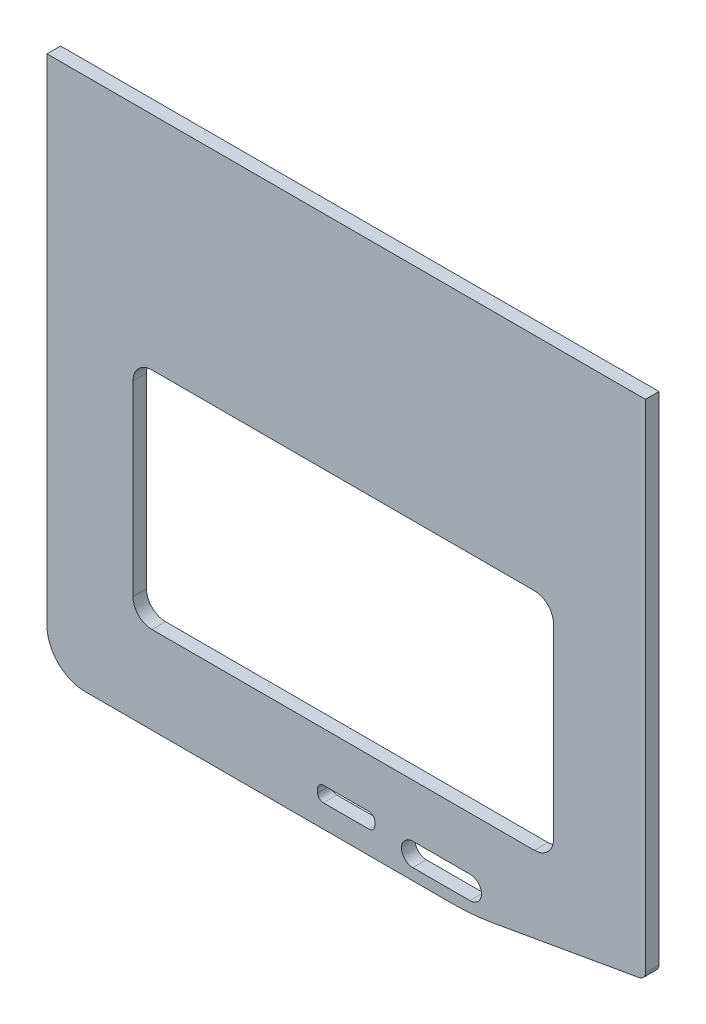
ISO-10303-21;
HEADER;
FILE_DESCRIPTION(('STEP AP214'),'2;1');
FILE_NAME('part.step','',(''),(''),'','','');
FILE_SCHEMA(('AUTOMOTIVE_DESIGN { 1 0 10303 214 1 1 1 1 }'));
ENDSEC;
DATA;
#1=APPLICATION_CONTEXT('core data for automotive mechanical design processes');
#2=APPLICATION_PROTOCOL_DEFINITION('international standard','automotive_design',2000,#1);
#3=PRODUCT_CONTEXT('',#1,'mechanical');
#4=PRODUCT('Part','Part','',(#3));
#5=PRODUCT_RELATED_PRODUCT_CATEGORY('part','',(#4));
#6=PRODUCT_DEFINITION_FORMATION('','',#4);
#7=PRODUCT_DEFINITION_CONTEXT('part definition',#1,'design');
#8=PRODUCT_DEFINITION('design','',#6,#7);
#9=PRODUCT_DEFINITION_SHAPE('','',#8);
#10=(LENGTH_UNIT() NAMED_UNIT(*) SI_UNIT(.MILLI.,.METRE.));
#11=(NAMED_UNIT(*) PLANE_ANGLE_UNIT() SI_UNIT($,.RADIAN.));
#12=(NAMED_UNIT(*) SI_UNIT($,.STERADIAN.) SOLID_ANGLE_UNIT());
#13=UNCERTAINTY_MEASURE_WITH_UNIT(LENGTH_MEASURE(1.E-05),#10,'distance_accuracy_value','');
#14=(GEOMETRIC_REPRESENTATION_CONTEXT(3) GLOBAL_UNCERTAINTY_ASSIGNED_CONTEXT((#13)) GLOBAL_UNIT_ASSIGNED_CONTEXT((#10,
#11,#12)) REPRESENTATION_CONTEXT('',''));
#15=CARTESIAN_POINT('',(0.,0.,0.));
#16=DIRECTION('',(0.,0.,1.));
#17=DIRECTION('',(1.,0.,0.));
#18=AXIS2_PLACEMENT_3D('',#15,#16,#17);
#19=CARTESIAN_POINT('',(157.112,260.,-7.112));
#20=DIRECTION('',(-1.,0.,0.));
#21=DIRECTION('',(0.,0.,1.));
#22=AXIS2_PLACEMENT_3D('',#19,#20,#21);
#23=PLANE('',#22);
#24=DIRECTION('',(0.,-1.,0.));
#25=VECTOR('',#24,1.);
#26=CARTESIAN_POINT('',(157.112,260.,0.));
#27=LINE('',#26,#25);
#28=CARTESIAN_POINT('',(157.112,260.,0.));
#29=VERTEX_POINT('',#28);
#30=CARTESIAN_POINT('',(157.112,-0.643601475291244,0.));
#31=VERTEX_POINT('',#30);
#32=EDGE_CURVE('E358',#29,#31,#27,.T.);
#33=ORIENTED_EDGE('',*,*,#32,.T.);
#34=DIRECTION('',(0.,0.,1.));
#35=VECTOR('',#34,1.);
#36=CARTESIAN_POINT('',(157.112,-0.643601475291244,-7.112));
#37=LINE('',#36,#35);
#38=CARTESIAN_POINT('',(157.112,-0.643601475291244,-7.112));
#39=VERTEX_POINT('',#38);
#40=EDGE_CURVE('E46',#31,#39,#37,.F.);
#41=ORIENTED_EDGE('',*,*,#40,.T.);
#42=DIRECTION('',(0.,-1.,0.));
#43=VECTOR('',#42,1.);
#44=CARTESIAN_POINT('',(157.112,260.,-7.112));
#45=LINE('',#44,#43);
#46=CARTESIAN_POINT('',(157.112,260.,-7.112));
#47=VERTEX_POINT('',#46);
#48=EDGE_CURVE('E374',#47,#39,#45,.T.);
#49=ORIENTED_EDGE('',*,*,#48,.F.);
#50=DIRECTION('',(0.,0.,1.));
#51=VECTOR('',#50,1.);
#52=CARTESIAN_POINT('',(157.112,260.,-7.112));
#53=LINE('',#52,#51);
#54=EDGE_CURVE('E385',#47,#29,#53,.T.);
#55=ORIENTED_EDGE('',*,*,#54,.T.);
#56=EDGE_LOOP('',(#33,#41,#49,#55));
#57=FACE_BOUND('',#56,.T.);
#58=ADVANCED_FACE('F38',(#57),#23,.F.);
#59=CARTESIAN_POINT('',(157.112,-20.0000000000004,-7.112));
#60=DIRECTION('',(0.,1.,0.));
#61=DIRECTION('',(-1.,0.,0.));
#62=AXIS2_PLACEMENT_3D('',#59,#60,#61);
#63=PLANE('',#62);
#64=DIRECTION('',(-1.,0.,0.));
#65=VECTOR('',#64,1.);
#66=CARTESIAN_POINT('',(157.112,-20.0000000000004,0.));
#67=LINE('',#66,#65);
#68=CARTESIAN_POINT('',(55.8728512630026,-20.0000000000004,0.));
#69=VERTEX_POINT('',#68);
#70=CARTESIAN_POINT('',(-137.112,-20.0000000000003,0.));
#71=VERTEX_POINT('',#70);
#72=EDGE_CURVE('E388',#69,#71,#67,.T.);
#73=ORIENTED_EDGE('',*,*,#72,.T.);
#74=DIRECTION('',(0.,0.,1.));
#75=VECTOR('',#74,1.);
#76=CARTESIAN_POINT('',(-137.112,-20.0000000000003,-7.112));
#77=LINE('',#76,#75);
#78=CARTESIAN_POINT('',(-137.112,-20.0000000000003,-7.112));
#79=VERTEX_POINT('',#78);
#80=EDGE_CURVE('E439',#71,#79,#77,.F.);
#81=ORIENTED_EDGE('',*,*,#80,.T.);
#82=DIRECTION('',(-1.,0.,0.));
#83=VECTOR('',#82,1.);
#84=CARTESIAN_POINT('',(157.112,-20.0000000000004,-7.112));
#85=LINE('',#84,#83);
#86=CARTESIAN_POINT('',(55.8728512630026,-20.0000000000004,-7.112));
#87=VERTEX_POINT('',#86);
#88=EDGE_CURVE('E377',#87,#79,#85,.T.);
#89=ORIENTED_EDGE('',*,*,#88,.F.);
#90=DIRECTION('',(0.,0.,1.));
#91=VECTOR('',#90,1.);
#92=CARTESIAN_POINT('',(55.8728512630026,-20.0000000000004,-7.112));
#93=LINE('',#92,#91);
#94=EDGE_CURVE('E423',#87,#69,#93,.T.);
#95=ORIENTED_EDGE('',*,*,#94,.T.);
#96=EDGE_LOOP('',(#73,#81,#89,#95));
#97=FACE_BOUND('',#96,.T.);
#98=ADVANCED_FACE('F472',(#97),#63,.F.);
#99=CARTESIAN_POINT('',(-157.112,260.,-7.112));
#100=DIRECTION('',(1.,0.,0.));
#101=DIRECTION('',(0.,0.,-1.));
#102=AXIS2_PLACEMENT_3D('',#99,#100,#101);
#103=PLANE('',#102);
#104=DIRECTION('',(0.,1.,0.));
#105=VECTOR('',#104,1.);
#106=CARTESIAN_POINT('',(-157.112,260.,-7.112));
#107=LINE('',#106,#105);
#108=CARTESIAN_POINT('',(-157.112,-3.33066907387547E-13,-7.112));
#109=VERTEX_POINT('',#108);
#110=CARTESIAN_POINT('',(-157.112,260.,-7.112));
#111=VERTEX_POINT('',#110);
#112=EDGE_CURVE('E381',#109,#111,#107,.T.);
#113=ORIENTED_EDGE('',*,*,#112,.F.);
#114=DIRECTION('',(0.,0.,1.));
#115=VECTOR('',#114,1.);
#116=CARTESIAN_POINT('',(-157.112,-3.33066907387547E-13,-7.112));
#117=LINE('',#116,#115);
#118=CARTESIAN_POINT('',(-157.112,-3.33066907387547E-13,0.));
#119=VERTEX_POINT('',#118);
#120=EDGE_CURVE('E434',#109,#119,#117,.T.);
#121=ORIENTED_EDGE('',*,*,#120,.T.);
#122=DIRECTION('',(0.,1.,0.));
#123=VECTOR('',#122,1.);
#124=CARTESIAN_POINT('',(-157.112,260.,0.));
#125=LINE('',#124,#123);
#126=CARTESIAN_POINT('',(-157.112,260.,0.));
#127=VERTEX_POINT('',#126);
#128=EDGE_CURVE('E391',#119,#127,#125,.T.);
#129=ORIENTED_EDGE('',*,*,#128,.T.);
#130=DIRECTION('',(0.,0.,1.));
#131=VECTOR('',#130,1.);
#132=CARTESIAN_POINT('',(-157.112,260.,-7.112));
#133=LINE('',#132,#131);
#134=EDGE_CURVE('E396',#111,#127,#133,.T.);
#135=ORIENTED_EDGE('',*,*,#134,.F.);
#136=EDGE_LOOP('',(#113,#121,#129,#135));
#137=FACE_BOUND('',#136,.T.);
#138=ADVANCED_FACE('F480',(#137),#103,.F.);
#139=CARTESIAN_POINT('',(157.112,260.,-7.112));
#140=DIRECTION('',(0.,-1.,0.));
#141=DIRECTION('',(0.,0.,-1.));
#142=AXIS2_PLACEMENT_3D('',#139,#140,#141);
#143=PLANE('',#142);
#144=DIRECTION('',(1.,0.,0.));
#145=VECTOR('',#144,1.);
#146=CARTESIAN_POINT('',(157.112,260.,0.));
#147=LINE('',#146,#145);
#148=EDGE_CURVE('E378',#127,#29,#147,.T.);
#149=ORIENTED_EDGE('',*,*,#148,.T.);
#150=ORIENTED_EDGE('',*,*,#54,.F.);
#151=DIRECTION('',(1.,0.,0.));
#152=VECTOR('',#151,1.);
#153=CARTESIAN_POINT('',(157.112,260.,-7.112));
#154=LINE('',#153,#152);
#155=EDGE_CURVE('E383',#111,#47,#154,.T.);
#156=ORIENTED_EDGE('',*,*,#155,.F.);
#157=ORIENTED_EDGE('',*,*,#134,.T.);
#158=EDGE_LOOP('',(#149,#150,#156,#157));
#159=FACE_BOUND('',#158,.T.);
#160=ADVANCED_FACE('F484',(#159),#143,.F.);
#161=CARTESIAN_POINT('',(0.,0.,-7.112));
#162=DIRECTION('',(0.,0.,-1.));
#163=DIRECTION('',(-1.,0.,0.));
#164=AXIS2_PLACEMENT_3D('',#161,#162,#163);
#165=PLANE('',#164);
#166=CARTESIAN_POINT('',(35.,-7.99999999999999,-7.112));
#167=DIRECTION('',(0.,0.,1.));
#168=DIRECTION('',(1.,0.,0.));
#169=AXIS2_PLACEMENT_3D('',#166,#167,#168);
#170=CIRCLE('',#169,6.);
#171=CARTESIAN_POINT('',(35.,-1.99999999999999,-7.112));
#172=VERTEX_POINT('',#171);
#173=CARTESIAN_POINT('',(35.,-14.,-7.112));
#174=VERTEX_POINT('',#173);
#175=EDGE_CURVE('E224',#172,#174,#170,.T.);
#176=ORIENTED_EDGE('',*,*,#175,.T.);
#177=DIRECTION('',(1.,0.,0.));
#178=VECTOR('',#177,1.);
#179=CARTESIAN_POINT('',(35.,-14.,-7.112));
#180=LINE('',#179,#178);
#181=CARTESIAN_POINT('',(65.,-14.,-7.112));
#182=VERTEX_POINT('',#181);
#183=EDGE_CURVE('E233',#174,#182,#180,.T.);
#184=ORIENTED_EDGE('',*,*,#183,.T.);
#185=CARTESIAN_POINT('',(65.,-7.99999999999999,-7.112));
#186=DIRECTION('',(0.,0.,1.));
#187=DIRECTION('',(1.,0.,0.));
#188=AXIS2_PLACEMENT_3D('',#185,#186,#187);
#189=CIRCLE('',#188,6.);
#190=CARTESIAN_POINT('',(65.,-1.99999999999999,-7.112));
#191=VERTEX_POINT('',#190);
#192=EDGE_CURVE('E53',#182,#191,#189,.T.);
#193=ORIENTED_EDGE('',*,*,#192,.T.);
#194=DIRECTION('',(-1.,0.,0.));
#195=VECTOR('',#194,1.);
#196=CARTESIAN_POINT('',(35.,-1.99999999999999,-7.112));
#197=LINE('',#196,#195);
#198=EDGE_CURVE('E230',#191,#172,#197,.T.);
#199=ORIENTED_EDGE('',*,*,#198,.T.);
#200=EDGE_LOOP('',(#176,#184,#193,#199));
#201=FACE_BOUND('',#200,.T.);
#202=ORIENTED_EDGE('',*,*,#48,.T.);
#203=CARTESIAN_POINT('',(153.112,-0.64360147529126,-7.112));
#204=DIRECTION('',(0.,0.,-1.));
#205=DIRECTION('',(-1.,0.,0.));
#206=AXIS2_PLACEMENT_3D('',#203,#204,#205);
#207=CIRCLE('',#206,4.);
#208=CARTESIAN_POINT('',(153.806592710668,-4.5828324873401,-7.112));
#209=VERTEX_POINT('',#208);
#210=EDGE_CURVE('E11',#39,#209,#207,.T.);
#211=ORIENTED_EDGE('',*,*,#210,.T.);
#212=DIRECTION('',(-0.984807753012209,-0.173648177666924,0.));
#213=VECTOR('',#212,1.);
#214=CARTESIAN_POINT('',(66.3714908861131,-20.0000000000004,-7.112));
#215=LINE('',#214,#213);
#216=CARTESIAN_POINT('',(76.7106325830335,-18.1769303614655,-7.112));
#217=VERTEX_POINT('',#216);
#218=EDGE_CURVE('E259',#209,#217,#215,.T.);
#219=ORIENTED_EDGE('',*,*,#218,.T.);
#220=CARTESIAN_POINT('',(55.8728512630027,99.9999999999996,-7.112));
#221=DIRECTION('',(0.,0.,-1.));
#222=DIRECTION('',(-1.,0.,0.));
#223=AXIS2_PLACEMENT_3D('',#220,#221,#222);
#224=CIRCLE('',#223,120.);
#225=EDGE_CURVE('E432',#217,#87,#224,.T.);
#226=ORIENTED_EDGE('',*,*,#225,.T.);
#227=ORIENTED_EDGE('',*,*,#88,.T.);
#228=CARTESIAN_POINT('',(-137.112,-3.33066907387547E-13,-7.112));
#229=DIRECTION('',(0.,0.,-1.));
#230=DIRECTION('',(-1.,0.,0.));
#231=AXIS2_PLACEMENT_3D('',#228,#229,#230);
#232=CIRCLE('',#231,20.);
#233=EDGE_CURVE('E441',#79,#109,#232,.T.);
#234=ORIENTED_EDGE('',*,*,#233,.T.);
#235=ORIENTED_EDGE('',*,*,#112,.T.);
#236=ORIENTED_EDGE('',*,*,#155,.T.);
#237=EDGE_LOOP('',(#202,#211,#219,#226,#227,#234,#235,#236));
#238=FACE_BOUND('',#237,.T.);
#239=CARTESIAN_POINT('',(-12.,-5.,-7.112));
#240=DIRECTION('',(0.,0.,1.));
#241=DIRECTION('',(-1.,0.,0.));
#242=AXIS2_PLACEMENT_3D('',#239,#240,#241);
#243=CIRCLE('',#242,3.);
#244=CARTESIAN_POINT('',(-15.,-5.,-7.112));
#245=VERTEX_POINT('',#244);
#246=CARTESIAN_POINT('',(-12.,-8.,-7.112));
#247=VERTEX_POINT('',#246);
#248=EDGE_CURVE('E263',#245,#247,#243,.T.);
#249=ORIENTED_EDGE('',*,*,#248,.T.);
#250=DIRECTION('',(1.,0.,0.));
#251=VECTOR('',#250,1.);
#252=CARTESIAN_POINT('',(-12.,-8.,-7.112));
#253=LINE('',#252,#251);
#254=CARTESIAN_POINT('',(12.,-8.,-7.112));
#255=VERTEX_POINT('',#254);
#256=EDGE_CURVE('E266',#247,#255,#253,.T.);
#257=ORIENTED_EDGE('',*,*,#256,.T.);
#258=CARTESIAN_POINT('',(12.,-5.,-7.112));
#259=DIRECTION('',(0.,0.,1.));
#260=DIRECTION('',(1.,0.,0.));
#261=AXIS2_PLACEMENT_3D('',#258,#259,#260);
#262=CIRCLE('',#261,3.);
#263=CARTESIAN_POINT('',(15.,-5.,-7.112));
#264=VERTEX_POINT('',#263);
#265=EDGE_CURVE('E270',#255,#264,#262,.T.);
#266=ORIENTED_EDGE('',*,*,#265,.T.);
#267=DIRECTION('',(0.,1.,0.));
#268=VECTOR('',#267,1.);
#269=CARTESIAN_POINT('',(15.,-5.,-7.112));
#270=LINE('',#269,#268);
#271=CARTESIAN_POINT('',(15.,-3.,-7.112));
#272=VERTEX_POINT('',#271);
#273=EDGE_CURVE('E273',#264,#272,#270,.T.);
#274=ORIENTED_EDGE('',*,*,#273,.T.);
#275=CARTESIAN_POINT('',(12.,-3.,-7.112));
#276=DIRECTION('',(0.,0.,1.));
#277=DIRECTION('',(1.,0.,0.));
#278=AXIS2_PLACEMENT_3D('',#275,#276,#277);
#279=CIRCLE('',#278,3.);
#280=CARTESIAN_POINT('',(12.,0.,-7.112));
#281=VERTEX_POINT('',#280);
#282=EDGE_CURVE('E276',#272,#281,#279,.T.);
#283=ORIENTED_EDGE('',*,*,#282,.T.);
#284=DIRECTION('',(-1.,0.,0.));
#285=VECTOR('',#284,1.);
#286=CARTESIAN_POINT('',(-12.,0.,-7.112));
#287=LINE('',#286,#285);
#288=CARTESIAN_POINT('',(-12.,0.,-7.112));
#289=VERTEX_POINT('',#288);
#290=EDGE_CURVE('E279',#281,#289,#287,.T.);
#291=ORIENTED_EDGE('',*,*,#290,.T.);
#292=CARTESIAN_POINT('',(-12.,-3.,-7.112));
#293=DIRECTION('',(0.,0.,1.));
#294=DIRECTION('',(-1.,0.,0.));
#295=AXIS2_PLACEMENT_3D('',#292,#293,#294);
#296=CIRCLE('',#295,3.);
#297=CARTESIAN_POINT('',(-15.,-3.,-7.112));
#298=VERTEX_POINT('',#297);
#299=EDGE_CURVE('E282',#289,#298,#296,.T.);
#300=ORIENTED_EDGE('',*,*,#299,.T.);
#301=DIRECTION('',(0.,-1.,0.));
#302=VECTOR('',#301,1.);
#303=CARTESIAN_POINT('',(-15.,-5.,-7.112));
#304=LINE('',#303,#302);
#305=EDGE_CURVE('E285',#298,#245,#304,.T.);
#306=ORIENTED_EDGE('',*,*,#305,.T.);
#307=EDGE_LOOP('',(#249,#257,#266,#274,#283,#291,#300,#306));
#308=FACE_BOUND('',#307,.T.);
#309=CARTESIAN_POINT('',(-101.985505074367,35.7979688309342,-7.112));
#310=DIRECTION('',(0.,0.,1.));
#311=DIRECTION('',(1.,0.,0.));
#312=AXIS2_PLACEMENT_3D('',#309,#310,#311);
#313=CIRCLE('',#312,9.99999999999999);
#314=CARTESIAN_POINT('',(-111.985505074367,35.7979688309342,-7.112));
#315=VERTEX_POINT('',#314);
#316=CARTESIAN_POINT('',(-101.985505074367,25.7979688309342,-7.112));
#317=VERTEX_POINT('',#316);
#318=EDGE_CURVE('E312',#315,#317,#313,.T.);
#319=ORIENTED_EDGE('',*,*,#318,.T.);
#320=DIRECTION('',(1.,0.,0.));
#321=VECTOR('',#320,1.);
#322=CARTESIAN_POINT('',(-101.985505074367,25.7979688309342,-7.112));
#323=LINE('',#322,#321);
#324=CARTESIAN_POINT('',(98.8038517576797,25.7979688309342,-7.112));
#325=VERTEX_POINT('',#324);
#326=EDGE_CURVE('E329',#317,#325,#323,.T.);
#327=ORIENTED_EDGE('',*,*,#326,.T.);
#328=CARTESIAN_POINT('',(98.8038517576797,35.7979688309342,-7.112));
#329=DIRECTION('',(0.,0.,1.));
#330=DIRECTION('',(1.,0.,0.));
#331=AXIS2_PLACEMENT_3D('',#328,#329,#330);
#332=CIRCLE('',#331,10.);
#333=CARTESIAN_POINT('',(108.80385175768,35.7979688309342,-7.112));
#334=VERTEX_POINT('',#333);
#335=EDGE_CURVE('E332',#325,#334,#332,.T.);
#336=ORIENTED_EDGE('',*,*,#335,.T.);
#337=DIRECTION('',(0.,1.,0.));
#338=VECTOR('',#337,1.);
#339=CARTESIAN_POINT('',(108.80385175768,133.817457954109,-7.112));
#340=LINE('',#339,#338);
#341=CARTESIAN_POINT('',(108.80385175768,133.817457954109,-7.112));
#342=VERTEX_POINT('',#341);
#343=EDGE_CURVE('E335',#334,#342,#340,.T.);
#344=ORIENTED_EDGE('',*,*,#343,.T.);
#345=CARTESIAN_POINT('',(98.8038517576797,133.817457954109,-7.112));
#346=DIRECTION('',(0.,0.,1.));
#347=DIRECTION('',(-1.,0.,0.));
#348=AXIS2_PLACEMENT_3D('',#345,#346,#347);
#349=CIRCLE('',#348,10.);
#350=CARTESIAN_POINT('',(98.8038517576797,143.817457954109,-7.112));
#351=VERTEX_POINT('',#350);
#352=EDGE_CURVE('E338',#342,#351,#349,.T.);
#353=ORIENTED_EDGE('',*,*,#352,.T.);
#354=DIRECTION('',(-1.,0.,0.));
#355=VECTOR('',#354,1.);
#356=CARTESIAN_POINT('',(-101.985505074367,143.817457954109,-7.112));
#357=LINE('',#356,#355);
#358=CARTESIAN_POINT('',(-101.985505074367,143.817457954109,-7.112));
#359=VERTEX_POINT('',#358);
#360=EDGE_CURVE('E341',#351,#359,#357,.T.);
#361=ORIENTED_EDGE('',*,*,#360,.T.);
#362=CARTESIAN_POINT('',(-101.985505074367,133.817457954109,-7.112));
#363=DIRECTION('',(0.,0.,1.));
#364=DIRECTION('',(1.,0.,0.));
#365=AXIS2_PLACEMENT_3D('',#362,#363,#364);
#366=CIRCLE('',#365,10.);
#367=CARTESIAN_POINT('',(-111.985505074367,133.817457954109,-7.112));
#368=VERTEX_POINT('',#367);
#369=EDGE_CURVE('E344',#359,#368,#366,.T.);
#370=ORIENTED_EDGE('',*,*,#369,.T.);
#371=DIRECTION('',(0.,-1.,0.));
#372=VECTOR('',#371,1.);
#373=CARTESIAN_POINT('',(-111.985505074367,133.817457954109,-7.112));
#374=LINE('',#373,#372);
#375=EDGE_CURVE('E347',#368,#315,#374,.T.);
#376=ORIENTED_EDGE('',*,*,#375,.T.);
#377=EDGE_LOOP('',(#319,#327,#336,#344,#353,#361,#370,#376));
#378=FACE_BOUND('',#377,.T.);
#379=ADVANCED_FACE('F237',(#201,#238,#308,#378),#165,.T.);
#380=CARTESIAN_POINT('',(0.,0.,0.));
#381=DIRECTION('',(0.,0.,-1.));
#382=DIRECTION('',(-1.,0.,0.));
#383=AXIS2_PLACEMENT_3D('',#380,#381,#382);
#384=PLANE('',#383);
#385=DIRECTION('',(1.,0.,0.));
#386=VECTOR('',#385,1.);
#387=CARTESIAN_POINT('',(35.,-14.,0.));
#388=LINE('',#387,#386);
#389=CARTESIAN_POINT('',(35.,-14.,0.));
#390=VERTEX_POINT('',#389);
#391=CARTESIAN_POINT('',(65.,-14.,0.));
#392=VERTEX_POINT('',#391);
#393=EDGE_CURVE('E249',#390,#392,#388,.T.);
#394=ORIENTED_EDGE('',*,*,#393,.F.);
#395=CARTESIAN_POINT('',(35.,-7.99999999999999,0.));
#396=DIRECTION('',(0.,0.,1.));
#397=DIRECTION('',(1.,0.,0.));
#398=AXIS2_PLACEMENT_3D('',#395,#396,#397);
#399=CIRCLE('',#398,6.);
#400=CARTESIAN_POINT('',(35.,-1.99999999999999,0.));
#401=VERTEX_POINT('',#400);
#402=EDGE_CURVE('E61',#401,#390,#399,.T.);
#403=ORIENTED_EDGE('',*,*,#402,.F.);
#404=DIRECTION('',(-1.,0.,0.));
#405=VECTOR('',#404,1.);
#406=CARTESIAN_POINT('',(35.,-1.99999999999999,0.));
#407=LINE('',#406,#405);
#408=CARTESIAN_POINT('',(65.,-1.99999999999999,0.));
#409=VERTEX_POINT('',#408);
#410=EDGE_CURVE('E240',#409,#401,#407,.T.);
#411=ORIENTED_EDGE('',*,*,#410,.F.);
#412=CARTESIAN_POINT('',(65.,-7.99999999999999,0.));
#413=DIRECTION('',(0.,0.,1.));
#414=DIRECTION('',(1.,0.,0.));
#415=AXIS2_PLACEMENT_3D('',#412,#413,#414);
#416=CIRCLE('',#415,6.);
#417=EDGE_CURVE('E243',#392,#409,#416,.T.);
#418=ORIENTED_EDGE('',*,*,#417,.F.);
#419=EDGE_LOOP('',(#394,#403,#411,#418));
#420=FACE_BOUND('',#419,.T.);
#421=DIRECTION('',(1.,0.,0.));
#422=VECTOR('',#421,1.);
#423=CARTESIAN_POINT('',(-12.,-8.,0.));
#424=LINE('',#423,#422);
#425=CARTESIAN_POINT('',(-12.,-8.,0.));
#426=VERTEX_POINT('',#425);
#427=CARTESIAN_POINT('',(12.,-8.,0.));
#428=VERTEX_POINT('',#427);
#429=EDGE_CURVE('E290',#426,#428,#424,.T.);
#430=ORIENTED_EDGE('',*,*,#429,.F.);
#431=CARTESIAN_POINT('',(-12.,-5.,0.));
#432=DIRECTION('',(0.,0.,1.));
#433=DIRECTION('',(-1.,0.,0.));
#434=AXIS2_PLACEMENT_3D('',#431,#432,#433);
#435=CIRCLE('',#434,3.);
#436=CARTESIAN_POINT('',(-15.,-5.,0.));
#437=VERTEX_POINT('',#436);
#438=EDGE_CURVE('E261',#437,#426,#435,.T.);
#439=ORIENTED_EDGE('',*,*,#438,.F.);
#440=DIRECTION('',(0.,-1.,0.));
#441=VECTOR('',#440,1.);
#442=CARTESIAN_POINT('',(-15.,-5.,0.));
#443=LINE('',#442,#441);
#444=CARTESIAN_POINT('',(-15.,-3.,0.));
#445=VERTEX_POINT('',#444);
#446=EDGE_CURVE('E267',#445,#437,#443,.T.);
#447=ORIENTED_EDGE('',*,*,#446,.F.);
#448=CARTESIAN_POINT('',(-12.,-3.,0.));
#449=DIRECTION('',(0.,0.,1.));
#450=DIRECTION('',(-1.,0.,0.));
#451=AXIS2_PLACEMENT_3D('',#448,#449,#450);
#452=CIRCLE('',#451,3.);
#453=CARTESIAN_POINT('',(-12.,0.,0.));
#454=VERTEX_POINT('',#453);
#455=EDGE_CURVE('E305',#454,#445,#452,.T.);
#456=ORIENTED_EDGE('',*,*,#455,.F.);
#457=DIRECTION('',(-1.,0.,0.));
#458=VECTOR('',#457,1.);
#459=CARTESIAN_POINT('',(-12.,0.,0.));
#460=LINE('',#459,#458);
#461=CARTESIAN_POINT('',(12.,0.,0.));
#462=VERTEX_POINT('',#461);
#463=EDGE_CURVE('E302',#462,#454,#460,.T.);
#464=ORIENTED_EDGE('',*,*,#463,.F.);
#465=CARTESIAN_POINT('',(12.,-3.,0.));
#466=DIRECTION('',(0.,0.,1.));
#467=DIRECTION('',(1.,0.,0.));
#468=AXIS2_PLACEMENT_3D('',#465,#466,#467);
#469=CIRCLE('',#468,3.);
#470=CARTESIAN_POINT('',(15.,-3.,0.));
#471=VERTEX_POINT('',#470);
#472=EDGE_CURVE('E299',#471,#462,#469,.T.);
#473=ORIENTED_EDGE('',*,*,#472,.F.);
#474=DIRECTION('',(0.,1.,0.));
#475=VECTOR('',#474,1.);
#476=CARTESIAN_POINT('',(15.,-5.,0.));
#477=LINE('',#476,#475);
#478=CARTESIAN_POINT('',(15.,-5.,0.));
#479=VERTEX_POINT('',#478);
#480=EDGE_CURVE('E296',#479,#471,#477,.T.);
#481=ORIENTED_EDGE('',*,*,#480,.F.);
#482=CARTESIAN_POINT('',(12.,-5.,0.));
#483=DIRECTION('',(0.,0.,1.));
#484=DIRECTION('',(1.,0.,0.));
#485=AXIS2_PLACEMENT_3D('',#482,#483,#484);
#486=CIRCLE('',#485,3.);
#487=EDGE_CURVE('E293',#428,#479,#486,.T.);
#488=ORIENTED_EDGE('',*,*,#487,.F.);
#489=EDGE_LOOP('',(#430,#439,#447,#456,#464,#473,#481,#488));
#490=FACE_BOUND('',#489,.T.);
#491=DIRECTION('',(-1.,0.,0.));
#492=VECTOR('',#491,1.);
#493=CARTESIAN_POINT('',(0.,25.7979688309342,0.));
#494=LINE('',#493,#492);
#495=CARTESIAN_POINT('',(98.8038517576797,25.7979688309342,0.));
#496=VERTEX_POINT('',#495);
#497=CARTESIAN_POINT('',(-101.985505074367,25.7979688309342,0.));
#498=VERTEX_POINT('',#497);
#499=EDGE_CURVE('E399',#496,#498,#494,.T.);
#500=ORIENTED_EDGE('',*,*,#499,.T.);
#501=CARTESIAN_POINT('',(-101.985505074367,35.7979688309342,0.));
#502=DIRECTION('',(0.,0.,1.));
#503=DIRECTION('',(1.,0.,0.));
#504=AXIS2_PLACEMENT_3D('',#501,#502,#503);
#505=CIRCLE('',#504,9.99999999999999);
#506=CARTESIAN_POINT('',(-111.985505074367,35.7979688309342,0.));
#507=VERTEX_POINT('',#506);
#508=EDGE_CURVE('E420',#498,#507,#505,.F.);
#509=ORIENTED_EDGE('',*,*,#508,.T.);
#510=DIRECTION('',(0.,1.,0.));
#511=VECTOR('',#510,1.);
#512=CARTESIAN_POINT('',(-111.985505074367,0.,0.));
#513=LINE('',#512,#511);
#514=CARTESIAN_POINT('',(-111.985505074367,133.817457954109,0.));
#515=VERTEX_POINT('',#514);
#516=EDGE_CURVE('E417',#507,#515,#513,.T.);
#517=ORIENTED_EDGE('',*,*,#516,.T.);
#518=CARTESIAN_POINT('',(-101.985505074367,133.817457954109,0.));
#519=DIRECTION('',(0.,0.,1.));
#520=DIRECTION('',(1.,0.,0.));
#521=AXIS2_PLACEMENT_3D('',#518,#519,#520);
#522=CIRCLE('',#521,10.);
#523=CARTESIAN_POINT('',(-101.985505074367,143.817457954109,0.));
#524=VERTEX_POINT('',#523);
#525=EDGE_CURVE('E414',#515,#524,#522,.F.);
#526=ORIENTED_EDGE('',*,*,#525,.T.);
#527=DIRECTION('',(-1.,0.,0.));
#528=VECTOR('',#527,1.);
#529=CARTESIAN_POINT('',(0.,143.817457954109,0.));
#530=LINE('',#529,#528);
#531=CARTESIAN_POINT('',(98.8038517576797,143.817457954109,0.));
#532=VERTEX_POINT('',#531);
#533=EDGE_CURVE('E411',#524,#532,#530,.F.);
#534=ORIENTED_EDGE('',*,*,#533,.T.);
#535=CARTESIAN_POINT('',(98.8038517576797,133.817457954109,0.));
#536=DIRECTION('',(0.,0.,1.));
#537=DIRECTION('',(1.,0.,0.));
#538=AXIS2_PLACEMENT_3D('',#535,#536,#537);
#539=CIRCLE('',#538,10.);
#540=CARTESIAN_POINT('',(108.80385175768,133.817457954109,0.));
#541=VERTEX_POINT('',#540);
#542=EDGE_CURVE('E408',#532,#541,#539,.F.);
#543=ORIENTED_EDGE('',*,*,#542,.T.);
#544=DIRECTION('',(0.,1.,0.));
#545=VECTOR('',#544,1.);
#546=CARTESIAN_POINT('',(108.80385175768,0.,0.));
#547=LINE('',#546,#545);
#548=CARTESIAN_POINT('',(108.80385175768,35.7979688309342,0.));
#549=VERTEX_POINT('',#548);
#550=EDGE_CURVE('E405',#541,#549,#547,.F.);
#551=ORIENTED_EDGE('',*,*,#550,.T.);
#552=CARTESIAN_POINT('',(98.8038517576797,35.7979688309342,0.));
#553=DIRECTION('',(0.,0.,1.));
#554=DIRECTION('',(1.,0.,0.));
#555=AXIS2_PLACEMENT_3D('',#552,#553,#554);
#556=CIRCLE('',#555,10.);
#557=EDGE_CURVE('E402',#549,#496,#556,.F.);
#558=ORIENTED_EDGE('',*,*,#557,.T.);
#559=EDGE_LOOP('',(#500,#509,#517,#526,#534,#543,#551,#558));
#560=FACE_BOUND('',#559,.T.);
#561=DIRECTION('',(-0.984807753012209,-0.173648177666924,0.));
#562=VECTOR('',#561,1.);
#563=CARTESIAN_POINT('',(66.3714908861131,-20.0000000000004,0.));
#564=LINE('',#563,#562);
#565=CARTESIAN_POINT('',(153.806592710668,-4.5828324873401,0.));
#566=VERTEX_POINT('',#565);
#567=CARTESIAN_POINT('',(76.7106325830335,-18.1769303614655,0.));
#568=VERTEX_POINT('',#567);
#569=EDGE_CURVE('E255',#566,#568,#564,.T.);
#570=ORIENTED_EDGE('',*,*,#569,.F.);
#571=CARTESIAN_POINT('',(153.112,-0.64360147529126,0.));
#572=DIRECTION('',(0.,0.,-1.));
#573=DIRECTION('',(-1.,0.,0.));
#574=AXIS2_PLACEMENT_3D('',#571,#572,#573);
#575=CIRCLE('',#574,4.);
#576=EDGE_CURVE('E446',#566,#31,#575,.F.);
#577=ORIENTED_EDGE('',*,*,#576,.T.);
#578=ORIENTED_EDGE('',*,*,#32,.F.);
#579=ORIENTED_EDGE('',*,*,#148,.F.);
#580=ORIENTED_EDGE('',*,*,#128,.F.);
#581=CARTESIAN_POINT('',(-137.112,-3.33066907387547E-13,0.));
#582=DIRECTION('',(0.,0.,-1.));
#583=DIRECTION('',(-1.,0.,0.));
#584=AXIS2_PLACEMENT_3D('',#581,#582,#583);
#585=CIRCLE('',#584,20.);
#586=EDGE_CURVE('E437',#119,#71,#585,.F.);
#587=ORIENTED_EDGE('',*,*,#586,.T.);
#588=ORIENTED_EDGE('',*,*,#72,.F.);
#589=CARTESIAN_POINT('',(55.8728512630027,99.9999999999996,0.));
#590=DIRECTION('',(0.,0.,-1.));
#591=DIRECTION('',(-1.,0.,0.));
#592=AXIS2_PLACEMENT_3D('',#589,#590,#591);
#593=CIRCLE('',#592,120.);
#594=EDGE_CURVE('E426',#69,#568,#593,.F.);
#595=ORIENTED_EDGE('',*,*,#594,.T.);
#596=EDGE_LOOP('',(#570,#577,#578,#579,#580,#587,#588,#595));
#597=FACE_BOUND('',#596,.T.);
#598=ADVANCED_FACE('F462',(#420,#490,#560,#597),#384,.F.);
#599=CARTESIAN_POINT('',(-101.985505074367,35.7979688309342,-7.112));
#600=DIRECTION('',(0.,0.,1.));
#601=DIRECTION('',(1.,0.,0.));
#602=AXIS2_PLACEMENT_3D('',#599,#600,#601);
#603=CYLINDRICAL_SURFACE('',#602,9.99999999999999);
#604=DIRECTION('',(0.,0.,1.));
#605=VECTOR('',#604,1.);
#606=CARTESIAN_POINT('',(-101.985505074367,25.7979688309342,-7.112));
#607=LINE('',#606,#605);
#608=EDGE_CURVE('E350',#317,#498,#607,.T.);
#609=ORIENTED_EDGE('',*,*,#608,.F.);
#610=ORIENTED_EDGE('',*,*,#318,.F.);
#611=DIRECTION('',(0.,0.,1.));
#612=VECTOR('',#611,1.);
#613=CARTESIAN_POINT('',(-111.985505074367,35.7979688309342,-7.112));
#614=LINE('',#613,#612);
#615=EDGE_CURVE('E354',#315,#507,#614,.T.);
#616=ORIENTED_EDGE('',*,*,#615,.T.);
#617=ORIENTED_EDGE('',*,*,#508,.F.);
#618=EDGE_LOOP('',(#609,#610,#616,#617));
#619=FACE_BOUND('',#618,.T.);
#620=ADVANCED_FACE('F562',(#619),#603,.F.);
#621=CARTESIAN_POINT('',(-111.985505074367,133.817457954109,-7.112));
#622=DIRECTION('',(-1.,0.,0.));
#623=DIRECTION('',(0.,0.,1.));
#624=AXIS2_PLACEMENT_3D('',#621,#622,#623);
#625=PLANE('',#624);
#626=ORIENTED_EDGE('',*,*,#615,.F.);
#627=ORIENTED_EDGE('',*,*,#375,.F.);
#628=DIRECTION('',(0.,0.,1.));
#629=VECTOR('',#628,1.);
#630=CARTESIAN_POINT('',(-111.985505074367,133.817457954109,-7.112));
#631=LINE('',#630,#629);
#632=EDGE_CURVE('E351',#368,#515,#631,.T.);
#633=ORIENTED_EDGE('',*,*,#632,.T.);
#634=ORIENTED_EDGE('',*,*,#516,.F.);
#635=EDGE_LOOP('',(#626,#627,#633,#634));
#636=FACE_BOUND('',#635,.T.);
#637=ADVANCED_FACE('F558',(#636),#625,.F.);
#638=CARTESIAN_POINT('',(-101.985505074367,133.817457954109,-7.112));
#639=DIRECTION('',(0.,0.,1.));
#640=DIRECTION('',(1.,0.,0.));
#641=AXIS2_PLACEMENT_3D('',#638,#639,#640);
#642=CYLINDRICAL_SURFACE('',#641,10.);
#643=ORIENTED_EDGE('',*,*,#632,.F.);
#644=ORIENTED_EDGE('',*,*,#369,.F.);
#645=DIRECTION('',(0.,0.,1.));
#646=VECTOR('',#645,1.);
#647=CARTESIAN_POINT('',(-101.985505074367,143.817457954109,-7.112));
#648=LINE('',#647,#646);
#649=EDGE_CURVE('E355',#359,#524,#648,.T.);
#650=ORIENTED_EDGE('',*,*,#649,.T.);
#651=ORIENTED_EDGE('',*,*,#525,.F.);
#652=EDGE_LOOP('',(#643,#644,#650,#651));
#653=FACE_BOUND('',#652,.T.);
#654=ADVANCED_FACE('F561',(#653),#642,.F.);
#655=CARTESIAN_POINT('',(-101.985505074367,143.817457954109,-7.112));
#656=DIRECTION('',(0.,1.,0.));
#657=DIRECTION('',(0.,0.,1.));
#658=AXIS2_PLACEMENT_3D('',#655,#656,#657);
#659=PLANE('',#658);
#660=ORIENTED_EDGE('',*,*,#649,.F.);
#661=ORIENTED_EDGE('',*,*,#360,.F.);
#662=DIRECTION('',(0.,0.,1.));
#663=VECTOR('',#662,1.);
#664=CARTESIAN_POINT('',(98.8038517576797,143.817457954109,-7.112));
#665=LINE('',#664,#663);
#666=EDGE_CURVE('E363',#351,#532,#665,.T.);
#667=ORIENTED_EDGE('',*,*,#666,.T.);
#668=ORIENTED_EDGE('',*,*,#533,.F.);
#669=EDGE_LOOP('',(#660,#661,#667,#668));
#670=FACE_BOUND('',#669,.T.);
#671=ADVANCED_FACE('F566',(#670),#659,.F.);
#672=CARTESIAN_POINT('',(98.8038517576797,133.817457954109,-7.112));
#673=DIRECTION('',(0.,0.,1.));
#674=DIRECTION('',(1.,0.,0.));
#675=AXIS2_PLACEMENT_3D('',#672,#673,#674);
#676=CYLINDRICAL_SURFACE('',#675,10.);
#677=ORIENTED_EDGE('',*,*,#666,.F.);
#678=ORIENTED_EDGE('',*,*,#352,.F.);
#679=DIRECTION('',(0.,0.,1.));
#680=VECTOR('',#679,1.);
#681=CARTESIAN_POINT('',(108.80385175768,133.817457954109,-7.112));
#682=LINE('',#681,#680);
#683=EDGE_CURVE('E366',#342,#541,#682,.T.);
#684=ORIENTED_EDGE('',*,*,#683,.T.);
#685=ORIENTED_EDGE('',*,*,#542,.F.);
#686=EDGE_LOOP('',(#677,#678,#684,#685));
#687=FACE_BOUND('',#686,.T.);
#688=ADVANCED_FACE('F570',(#687),#676,.F.);
#689=CARTESIAN_POINT('',(108.80385175768,133.817457954109,-7.112));
#690=DIRECTION('',(1.,0.,0.));
#691=DIRECTION('',(0.,1.,0.));
#692=AXIS2_PLACEMENT_3D('',#689,#690,#691);
#693=PLANE('',#692);
#694=ORIENTED_EDGE('',*,*,#683,.F.);
#695=ORIENTED_EDGE('',*,*,#343,.F.);
#696=DIRECTION('',(0.,0.,1.));
#697=VECTOR('',#696,1.);
#698=CARTESIAN_POINT('',(108.80385175768,35.7979688309342,-7.112));
#699=LINE('',#698,#697);
#700=EDGE_CURVE('E369',#334,#549,#699,.T.);
#701=ORIENTED_EDGE('',*,*,#700,.T.);
#702=ORIENTED_EDGE('',*,*,#550,.F.);
#703=EDGE_LOOP('',(#694,#695,#701,#702));
#704=FACE_BOUND('',#703,.T.);
#705=ADVANCED_FACE('F574',(#704),#693,.F.);
#706=CARTESIAN_POINT('',(98.8038517576797,35.7979688309342,-7.112));
#707=DIRECTION('',(0.,0.,1.));
#708=DIRECTION('',(1.,0.,0.));
#709=AXIS2_PLACEMENT_3D('',#706,#707,#708);
#710=CYLINDRICAL_SURFACE('',#709,10.);
#711=ORIENTED_EDGE('',*,*,#700,.F.);
#712=ORIENTED_EDGE('',*,*,#335,.F.);
#713=DIRECTION('',(0.,0.,1.));
#714=VECTOR('',#713,1.);
#715=CARTESIAN_POINT('',(98.8038517576797,25.7979688309342,-7.112));
#716=LINE('',#715,#714);
#717=EDGE_CURVE('E360',#325,#496,#716,.T.);
#718=ORIENTED_EDGE('',*,*,#717,.T.);
#719=ORIENTED_EDGE('',*,*,#557,.F.);
#720=EDGE_LOOP('',(#711,#712,#718,#719));
#721=FACE_BOUND('',#720,.T.);
#722=ADVANCED_FACE('F578',(#721),#710,.F.);
#723=CARTESIAN_POINT('',(-101.985505074367,25.7979688309342,-7.112));
#724=DIRECTION('',(0.,-1.,0.));
#725=DIRECTION('',(1.,0.,0.));
#726=AXIS2_PLACEMENT_3D('',#723,#724,#725);
#727=PLANE('',#726);
#728=ORIENTED_EDGE('',*,*,#717,.F.);
#729=ORIENTED_EDGE('',*,*,#326,.F.);
#730=ORIENTED_EDGE('',*,*,#608,.T.);
#731=ORIENTED_EDGE('',*,*,#499,.F.);
#732=EDGE_LOOP('',(#728,#729,#730,#731));
#733=FACE_BOUND('',#732,.T.);
#734=ADVANCED_FACE('F556',(#733),#727,.F.);
#735=CARTESIAN_POINT('',(-12.,-5.,-7.112));
#736=DIRECTION('',(0.,0.,1.));
#737=DIRECTION('',(1.,0.,0.));
#738=AXIS2_PLACEMENT_3D('',#735,#736,#737);
#739=CYLINDRICAL_SURFACE('',#738,3.);
#740=ORIENTED_EDGE('',*,*,#438,.T.);
#741=DIRECTION('',(0.,0.,1.));
#742=VECTOR('',#741,1.);
#743=CARTESIAN_POINT('',(-12.,-8.,-7.112));
#744=LINE('',#743,#742);
#745=EDGE_CURVE('E288',#247,#426,#744,.T.);
#746=ORIENTED_EDGE('',*,*,#745,.F.);
#747=ORIENTED_EDGE('',*,*,#248,.F.);
#748=DIRECTION('',(0.,0.,1.));
#749=VECTOR('',#748,1.);
#750=CARTESIAN_POINT('',(-15.,-5.,-7.112));
#751=LINE('',#750,#749);
#752=EDGE_CURVE('E310',#245,#437,#751,.T.);
#753=ORIENTED_EDGE('',*,*,#752,.T.);
#754=EDGE_LOOP('',(#740,#746,#747,#753));
#755=FACE_BOUND('',#754,.T.);
#756=ADVANCED_FACE('F530',(#755),#739,.F.);
#757=CARTESIAN_POINT('',(-15.,-5.,-7.112));
#758=DIRECTION('',(-1.,0.,0.));
#759=DIRECTION('',(0.,-1.,0.));
#760=AXIS2_PLACEMENT_3D('',#757,#758,#759);
#761=PLANE('',#760);
#762=ORIENTED_EDGE('',*,*,#446,.T.);
#763=ORIENTED_EDGE('',*,*,#752,.F.);
#764=ORIENTED_EDGE('',*,*,#305,.F.);
#765=DIRECTION('',(0.,0.,1.));
#766=VECTOR('',#765,1.);
#767=CARTESIAN_POINT('',(-15.,-3.,-7.112));
#768=LINE('',#767,#766);
#769=EDGE_CURVE('E313',#298,#445,#768,.T.);
#770=ORIENTED_EDGE('',*,*,#769,.T.);
#771=EDGE_LOOP('',(#762,#763,#764,#770));
#772=FACE_BOUND('',#771,.T.);
#773=ADVANCED_FACE('F526',(#772),#761,.F.);
#774=CARTESIAN_POINT('',(-12.,-3.,-7.112));
#775=DIRECTION('',(0.,0.,1.));
#776=DIRECTION('',(1.,0.,0.));
#777=AXIS2_PLACEMENT_3D('',#774,#775,#776);
#778=CYLINDRICAL_SURFACE('',#777,3.);
#779=ORIENTED_EDGE('',*,*,#455,.T.);
#780=ORIENTED_EDGE('',*,*,#769,.F.);
#781=ORIENTED_EDGE('',*,*,#299,.F.);
#782=DIRECTION('',(0.,0.,1.));
#783=VECTOR('',#782,1.);
#784=CARTESIAN_POINT('',(-12.,0.,-7.112));
#785=LINE('',#784,#783);
#786=EDGE_CURVE('E315',#289,#454,#785,.T.);
#787=ORIENTED_EDGE('',*,*,#786,.T.);
#788=EDGE_LOOP('',(#779,#780,#781,#787));
#789=FACE_BOUND('',#788,.T.);
#790=ADVANCED_FACE('F529',(#789),#778,.F.);
#791=CARTESIAN_POINT('',(-12.,0.,-7.112));
#792=DIRECTION('',(0.,1.,0.));
#793=DIRECTION('',(0.,0.,1.));
#794=AXIS2_PLACEMENT_3D('',#791,#792,#793);
#795=PLANE('',#794);
#796=ORIENTED_EDGE('',*,*,#463,.T.);
#797=ORIENTED_EDGE('',*,*,#786,.F.);
#798=ORIENTED_EDGE('',*,*,#290,.F.);
#799=DIRECTION('',(0.,0.,1.));
#800=VECTOR('',#799,1.);
#801=CARTESIAN_POINT('',(12.,0.,-7.112));
#802=LINE('',#801,#800);
#803=EDGE_CURVE('E317',#281,#462,#802,.T.);
#804=ORIENTED_EDGE('',*,*,#803,.T.);
#805=EDGE_LOOP('',(#796,#797,#798,#804));
#806=FACE_BOUND('',#805,.T.);
#807=ADVANCED_FACE('F534',(#806),#795,.F.);
#808=CARTESIAN_POINT('',(12.,-3.,-7.112));
#809=DIRECTION('',(0.,0.,1.));
#810=DIRECTION('',(1.,0.,0.));
#811=AXIS2_PLACEMENT_3D('',#808,#809,#810);
#812=CYLINDRICAL_SURFACE('',#811,3.);
#813=ORIENTED_EDGE('',*,*,#472,.T.);
#814=ORIENTED_EDGE('',*,*,#803,.F.);
#815=ORIENTED_EDGE('',*,*,#282,.F.);
#816=DIRECTION('',(0.,0.,1.));
#817=VECTOR('',#816,1.);
#818=CARTESIAN_POINT('',(15.,-3.,-7.112));
#819=LINE('',#818,#817);
#820=EDGE_CURVE('E319',#272,#471,#819,.T.);
#821=ORIENTED_EDGE('',*,*,#820,.T.);
#822=EDGE_LOOP('',(#813,#814,#815,#821));
#823=FACE_BOUND('',#822,.T.);
#824=ADVANCED_FACE('F538',(#823),#812,.F.);
#825=CARTESIAN_POINT('',(15.,-5.,-7.112));
#826=DIRECTION('',(1.,0.,0.));
#827=DIRECTION('',(0.,1.,0.));
#828=AXIS2_PLACEMENT_3D('',#825,#826,#827);
#829=PLANE('',#828);
#830=ORIENTED_EDGE('',*,*,#480,.T.);
#831=ORIENTED_EDGE('',*,*,#820,.F.);
#832=ORIENTED_EDGE('',*,*,#273,.F.);
#833=DIRECTION('',(0.,0.,1.));
#834=VECTOR('',#833,1.);
#835=CARTESIAN_POINT('',(15.,-5.,-7.112));
#836=LINE('',#835,#834);
#837=EDGE_CURVE('E321',#264,#479,#836,.T.);
#838=ORIENTED_EDGE('',*,*,#837,.T.);
#839=EDGE_LOOP('',(#830,#831,#832,#838));
#840=FACE_BOUND('',#839,.T.);
#841=ADVANCED_FACE('F542',(#840),#829,.F.);
#842=CARTESIAN_POINT('',(12.,-5.,-7.112));
#843=DIRECTION('',(0.,0.,1.));
#844=DIRECTION('',(1.,0.,0.));
#845=AXIS2_PLACEMENT_3D('',#842,#843,#844);
#846=CYLINDRICAL_SURFACE('',#845,3.);
#847=ORIENTED_EDGE('',*,*,#487,.T.);
#848=ORIENTED_EDGE('',*,*,#837,.F.);
#849=ORIENTED_EDGE('',*,*,#265,.F.);
#850=DIRECTION('',(0.,0.,1.));
#851=VECTOR('',#850,1.);
#852=CARTESIAN_POINT('',(12.,-8.,-7.112));
#853=LINE('',#852,#851);
#854=EDGE_CURVE('E323',#255,#428,#853,.T.);
#855=ORIENTED_EDGE('',*,*,#854,.T.);
#856=EDGE_LOOP('',(#847,#848,#849,#855));
#857=FACE_BOUND('',#856,.T.);
#858=ADVANCED_FACE('F546',(#857),#846,.F.);
#859=CARTESIAN_POINT('',(-12.,-8.,-7.112));
#860=DIRECTION('',(0.,-1.,0.));
#861=DIRECTION('',(0.,0.,-1.));
#862=AXIS2_PLACEMENT_3D('',#859,#860,#861);
#863=PLANE('',#862);
#864=ORIENTED_EDGE('',*,*,#429,.T.);
#865=ORIENTED_EDGE('',*,*,#854,.F.);
#866=ORIENTED_EDGE('',*,*,#256,.F.);
#867=ORIENTED_EDGE('',*,*,#745,.T.);
#868=EDGE_LOOP('',(#864,#865,#866,#867));
#869=FACE_BOUND('',#868,.T.);
#870=ADVANCED_FACE('F525',(#869),#863,.F.);
#871=CARTESIAN_POINT('',(66.3714908861131,-20.0000000000004,-7.112));
#872=DIRECTION('',(-0.173648177666924,0.984807753012209,0.));
#873=DIRECTION('',(-0.984807753012209,-0.173648177666924,0.));
#874=AXIS2_PLACEMENT_3D('',#871,#872,#873);
#875=PLANE('',#874);
#876=ORIENTED_EDGE('',*,*,#218,.F.);
#877=DIRECTION('',(0.,0.,1.));
#878=VECTOR('',#877,1.);
#879=CARTESIAN_POINT('',(153.806592710668,-4.5828324873401,-7.112));
#880=LINE('',#879,#878);
#881=EDGE_CURVE('E443',#209,#566,#880,.T.);
#882=ORIENTED_EDGE('',*,*,#881,.T.);
#883=ORIENTED_EDGE('',*,*,#569,.T.);
#884=DIRECTION('',(0.,0.,1.));
#885=VECTOR('',#884,1.);
#886=CARTESIAN_POINT('',(76.7106325830335,-18.1769303614655,-7.112));
#887=LINE('',#886,#885);
#888=EDGE_CURVE('E429',#568,#217,#887,.F.);
#889=ORIENTED_EDGE('',*,*,#888,.T.);
#890=EDGE_LOOP('',(#876,#882,#883,#889));
#891=FACE_BOUND('',#890,.T.);
#892=ADVANCED_FACE('F460',(#891),#875,.F.);
#893=CARTESIAN_POINT('',(55.8728512630027,99.9999999999996,-7.112));
#894=DIRECTION('',(0.,0.,1.));
#895=DIRECTION('',(1.,0.,0.));
#896=AXIS2_PLACEMENT_3D('',#893,#894,#895);
#897=CYLINDRICAL_SURFACE('',#896,120.);
#898=ORIENTED_EDGE('',*,*,#225,.F.);
#899=ORIENTED_EDGE('',*,*,#888,.F.);
#900=ORIENTED_EDGE('',*,*,#594,.F.);
#901=ORIENTED_EDGE('',*,*,#94,.F.);
#902=EDGE_LOOP('',(#898,#899,#900,#901));
#903=FACE_BOUND('',#902,.T.);
#904=ADVANCED_FACE('F468',(#903),#897,.T.);
#905=CARTESIAN_POINT('',(-137.112,-3.33066907387547E-13,-7.112));
#906=DIRECTION('',(0.,0.,1.));
#907=DIRECTION('',(1.,0.,0.));
#908=AXIS2_PLACEMENT_3D('',#905,#906,#907);
#909=CYLINDRICAL_SURFACE('',#908,20.);
#910=ORIENTED_EDGE('',*,*,#233,.F.);
#911=ORIENTED_EDGE('',*,*,#80,.F.);
#912=ORIENTED_EDGE('',*,*,#586,.F.);
#913=ORIENTED_EDGE('',*,*,#120,.F.);
#914=EDGE_LOOP('',(#910,#911,#912,#913));
#915=FACE_BOUND('',#914,.T.);
#916=ADVANCED_FACE('F475',(#915),#909,.T.);
#917=CARTESIAN_POINT('',(153.112,-0.64360147529126,-7.112));
#918=DIRECTION('',(0.,0.,1.));
#919=DIRECTION('',(1.,0.,0.));
#920=AXIS2_PLACEMENT_3D('',#917,#918,#919);
#921=CYLINDRICAL_SURFACE('',#920,4.);
#922=ORIENTED_EDGE('',*,*,#210,.F.);
#923=ORIENTED_EDGE('',*,*,#40,.F.);
#924=ORIENTED_EDGE('',*,*,#576,.F.);
#925=ORIENTED_EDGE('',*,*,#881,.F.);
#926=EDGE_LOOP('',(#922,#923,#924,#925));
#927=FACE_BOUND('',#926,.T.);
#928=ADVANCED_FACE('F40',(#927),#921,.T.);
#929=CARTESIAN_POINT('',(35.,-7.99999999999999,-7.112));
#930=DIRECTION('',(0.,0.,1.));
#931=DIRECTION('',(1.,0.,0.));
#932=AXIS2_PLACEMENT_3D('',#929,#930,#931);
#933=CYLINDRICAL_SURFACE('',#932,6.);
#934=ORIENTED_EDGE('',*,*,#402,.T.);
#935=DIRECTION('',(0.,0.,1.));
#936=VECTOR('',#935,1.);
#937=CARTESIAN_POINT('',(35.,-14.,-7.112));
#938=LINE('',#937,#936);
#939=EDGE_CURVE('E220',#174,#390,#938,.T.);
#940=ORIENTED_EDGE('',*,*,#939,.F.);
#941=ORIENTED_EDGE('',*,*,#175,.F.);
#942=DIRECTION('',(0.,0.,1.));
#943=VECTOR('',#942,1.);
#944=CARTESIAN_POINT('',(35.,-1.99999999999999,-7.112));
#945=LINE('',#944,#943);
#946=EDGE_CURVE('E253',#172,#401,#945,.T.);
#947=ORIENTED_EDGE('',*,*,#946,.T.);
#948=EDGE_LOOP('',(#934,#940,#941,#947));
#949=FACE_BOUND('',#948,.T.);
#950=ADVANCED_FACE('F222',(#949),#933,.F.);
#951=CARTESIAN_POINT('',(35.,-1.99999999999999,-7.112));
#952=DIRECTION('',(0.,1.,0.));
#953=DIRECTION('',(-1.,0.,0.));
#954=AXIS2_PLACEMENT_3D('',#951,#952,#953);
#955=PLANE('',#954);
#956=ORIENTED_EDGE('',*,*,#410,.T.);
#957=ORIENTED_EDGE('',*,*,#946,.F.);
#958=ORIENTED_EDGE('',*,*,#198,.F.);
#959=DIRECTION('',(0.,0.,1.));
#960=VECTOR('',#959,1.);
#961=CARTESIAN_POINT('',(65.,-1.99999999999999,-7.112));
#962=LINE('',#961,#960);
#963=EDGE_CURVE('E256',#191,#409,#962,.T.);
#964=ORIENTED_EDGE('',*,*,#963,.T.);
#965=EDGE_LOOP('',(#956,#957,#958,#964));
#966=FACE_BOUND('',#965,.T.);
#967=ADVANCED_FACE('F512',(#966),#955,.F.);
#968=CARTESIAN_POINT('',(65.,-7.99999999999999,-7.112));
#969=DIRECTION('',(0.,0.,1.));
#970=DIRECTION('',(1.,0.,0.));
#971=AXIS2_PLACEMENT_3D('',#968,#969,#970);
#972=CYLINDRICAL_SURFACE('',#971,6.);
#973=ORIENTED_EDGE('',*,*,#417,.T.);
#974=ORIENTED_EDGE('',*,*,#963,.F.);
#975=ORIENTED_EDGE('',*,*,#192,.F.);
#976=DIRECTION('',(0.,0.,1.));
#977=VECTOR('',#976,1.);
#978=CARTESIAN_POINT('',(65.,-14.,-7.112));
#979=LINE('',#978,#977);
#980=EDGE_CURVE('E229',#182,#392,#979,.T.);
#981=ORIENTED_EDGE('',*,*,#980,.T.);
#982=EDGE_LOOP('',(#973,#974,#975,#981));
#983=FACE_BOUND('',#982,.T.);
#984=ADVANCED_FACE('F517',(#983),#972,.F.);
#985=CARTESIAN_POINT('',(35.,-14.,-7.112));
#986=DIRECTION('',(0.,-1.,0.));
#987=DIRECTION('',(1.,0.,0.));
#988=AXIS2_PLACEMENT_3D('',#985,#986,#987);
#989=PLANE('',#988);
#990=ORIENTED_EDGE('',*,*,#393,.T.);
#991=ORIENTED_EDGE('',*,*,#980,.F.);
#992=ORIENTED_EDGE('',*,*,#183,.F.);
#993=ORIENTED_EDGE('',*,*,#939,.T.);
#994=EDGE_LOOP('',(#990,#991,#992,#993));
#995=FACE_BOUND('',#994,.T.);
#996=ADVANCED_FACE('F234',(#995),#989,.F.);
#997=CLOSED_SHELL('',(#58,#98,#138,#160,#379,#598,#620,#637,#654,#671,#688,#705,#722,#734,#756,
#773,#790,#807,#824,#841,#858,#870,#892,#904,#916,#928,#950,#967,#984,#996));
#998=MANIFOLD_SOLID_BREP('B2',#997);
#999=ADVANCED_BREP_SHAPE_REPRESENTATION('',(#18,#998),#14);
#1000=SHAPE_DEFINITION_REPRESENTATION(#9,#999);
ENDSEC;
END-ISO-10303-21;
